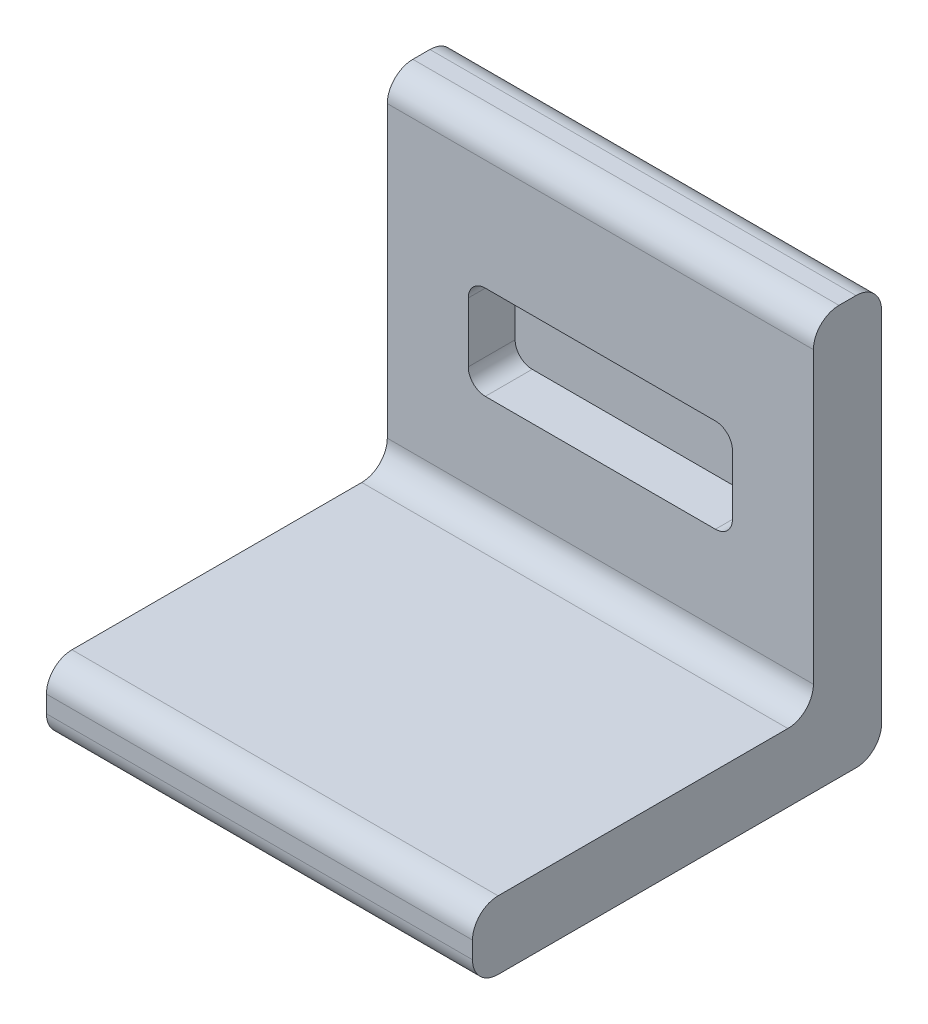
ISO-10303-21;
HEADER;
FILE_DESCRIPTION(('STEP AP214'),'2;1');
FILE_NAME('part.step','',(''),(''),'','','');
FILE_SCHEMA(('AUTOMOTIVE_DESIGN { 1 0 10303 214 1 1 1 1 }'));
ENDSEC;
DATA;
#1=APPLICATION_CONTEXT('core data for automotive mechanical design processes');
#2=APPLICATION_PROTOCOL_DEFINITION('international standard','automotive_design',2000,#1);
#3=PRODUCT_CONTEXT('',#1,'mechanical');
#4=PRODUCT('Part','Part','',(#3));
#5=PRODUCT_RELATED_PRODUCT_CATEGORY('part','',(#4));
#6=PRODUCT_DEFINITION_FORMATION('','',#4);
#7=PRODUCT_DEFINITION_CONTEXT('part definition',#1,'design');
#8=PRODUCT_DEFINITION('design','',#6,#7);
#9=PRODUCT_DEFINITION_SHAPE('','',#8);
#10=(LENGTH_UNIT() NAMED_UNIT(*) SI_UNIT(.MILLI.,.METRE.));
#11=(NAMED_UNIT(*) PLANE_ANGLE_UNIT() SI_UNIT($,.RADIAN.));
#12=(NAMED_UNIT(*) SI_UNIT($,.STERADIAN.) SOLID_ANGLE_UNIT());
#13=UNCERTAINTY_MEASURE_WITH_UNIT(LENGTH_MEASURE(1.E-05),#10,'distance_accuracy_value','');
#14=(GEOMETRIC_REPRESENTATION_CONTEXT(3) GLOBAL_UNCERTAINTY_ASSIGNED_CONTEXT((#13)) GLOBAL_UNIT_ASSIGNED_CONTEXT((#10,
#11,#12)) REPRESENTATION_CONTEXT('',''));
#15=CARTESIAN_POINT('',(0.,0.,0.));
#16=DIRECTION('',(0.,0.,1.));
#17=DIRECTION('',(1.,0.,0.));
#18=AXIS2_PLACEMENT_3D('',#15,#16,#17);
#19=CARTESIAN_POINT('',(-25.,8.,-40.));
#20=DIRECTION('',(1.,0.,0.));
#21=DIRECTION('',(0.,0.,-1.));
#22=AXIS2_PLACEMENT_3D('',#19,#20,#21);
#23=PLANE('',#22);
#24=DIRECTION('',(0.,-1.,0.));
#25=VECTOR('',#24,1.);
#26=CARTESIAN_POINT('',(-25.,8.,0.));
#27=LINE('',#26,#25);
#28=CARTESIAN_POINT('',(-25.,5.,0.));
#29=VERTEX_POINT('',#28);
#30=CARTESIAN_POINT('',(-25.,3.,0.));
#31=VERTEX_POINT('',#30);
#32=EDGE_CURVE('E265',#29,#31,#27,.T.);
#33=ORIENTED_EDGE('',*,*,#32,.F.);
#34=CARTESIAN_POINT('',(-25.,5.,-3.));
#35=DIRECTION('',(1.,0.,0.));
#36=DIRECTION('',(0.,0.,-1.));
#37=AXIS2_PLACEMENT_3D('',#34,#35,#36);
#38=CIRCLE('',#37,3.);
#39=CARTESIAN_POINT('',(-25.,8.,-3.));
#40=VERTEX_POINT('',#39);
#41=EDGE_CURVE('E355',#29,#40,#38,.F.);
#42=ORIENTED_EDGE('',*,*,#41,.T.);
#43=DIRECTION('',(0.,0.,1.));
#44=VECTOR('',#43,1.);
#45=CARTESIAN_POINT('',(-25.,8.,-40.));
#46=LINE('',#45,#44);
#47=CARTESIAN_POINT('',(-25.,8.,-37.));
#48=VERTEX_POINT('',#47);
#49=EDGE_CURVE('E246',#48,#40,#46,.T.);
#50=ORIENTED_EDGE('',*,*,#49,.F.);
#51=CARTESIAN_POINT('',(-25.,11.,-37.));
#52=DIRECTION('',(1.,0.,0.));
#53=DIRECTION('',(0.,0.,-1.));
#54=AXIS2_PLACEMENT_3D('',#51,#52,#53);
#55=CIRCLE('',#54,3.);
#56=CARTESIAN_POINT('',(-25.,11.,-40.));
#57=VERTEX_POINT('',#56);
#58=EDGE_CURVE('E48',#48,#57,#55,.T.);
#59=ORIENTED_EDGE('',*,*,#58,.T.);
#60=DIRECTION('',(0.,1.,0.));
#61=VECTOR('',#60,1.);
#62=CARTESIAN_POINT('',(-25.,48.,-40.));
#63=LINE('',#62,#61);
#64=CARTESIAN_POINT('',(-25.,45.,-40.));
#65=VERTEX_POINT('',#64);
#66=EDGE_CURVE('E226',#57,#65,#63,.T.);
#67=ORIENTED_EDGE('',*,*,#66,.T.);
#68=CARTESIAN_POINT('',(-25.,45.,-43.));
#69=DIRECTION('',(1.,0.,0.));
#70=DIRECTION('',(0.,0.,-1.));
#71=AXIS2_PLACEMENT_3D('',#68,#69,#70);
#72=CIRCLE('',#71,3.);
#73=CARTESIAN_POINT('',(-25.,48.,-43.));
#74=VERTEX_POINT('',#73);
#75=EDGE_CURVE('E352',#65,#74,#72,.F.);
#76=ORIENTED_EDGE('',*,*,#75,.T.);
#77=DIRECTION('',(0.,0.,1.));
#78=VECTOR('',#77,1.);
#79=CARTESIAN_POINT('',(-25.,48.,-48.));
#80=LINE('',#79,#78);
#81=CARTESIAN_POINT('',(-25.,48.,-45.));
#82=VERTEX_POINT('',#81);
#83=EDGE_CURVE('E241',#82,#74,#80,.T.);
#84=ORIENTED_EDGE('',*,*,#83,.F.);
#85=CARTESIAN_POINT('',(-25.,45.,-45.));
#86=DIRECTION('',(1.,0.,0.));
#87=DIRECTION('',(0.,0.,-1.));
#88=AXIS2_PLACEMENT_3D('',#85,#86,#87);
#89=CIRCLE('',#88,3.);
#90=CARTESIAN_POINT('',(-25.,45.,-48.));
#91=VERTEX_POINT('',#90);
#92=EDGE_CURVE('E55',#82,#91,#89,.F.);
#93=ORIENTED_EDGE('',*,*,#92,.T.);
#94=DIRECTION('',(0.,1.,0.));
#95=VECTOR('',#94,1.);
#96=CARTESIAN_POINT('',(-25.,48.,-48.));
#97=LINE('',#96,#95);
#98=CARTESIAN_POINT('',(-25.,3.,-48.));
#99=VERTEX_POINT('',#98);
#100=EDGE_CURVE('E225',#99,#91,#97,.T.);
#101=ORIENTED_EDGE('',*,*,#100,.F.);
#102=CARTESIAN_POINT('',(-25.,3.,-45.));
#103=DIRECTION('',(1.,0.,0.));
#104=DIRECTION('',(0.,0.,-1.));
#105=AXIS2_PLACEMENT_3D('',#102,#103,#104);
#106=CIRCLE('',#105,3.);
#107=CARTESIAN_POINT('',(-25.,0.,-45.));
#108=VERTEX_POINT('',#107);
#109=EDGE_CURVE('E63',#99,#108,#106,.F.);
#110=ORIENTED_EDGE('',*,*,#109,.T.);
#111=DIRECTION('',(0.,0.,1.));
#112=VECTOR('',#111,1.);
#113=CARTESIAN_POINT('',(-25.,0.,-40.));
#114=LINE('',#113,#112);
#115=CARTESIAN_POINT('',(-25.,0.,-3.));
#116=VERTEX_POINT('',#115);
#117=EDGE_CURVE('E245',#108,#116,#114,.T.);
#118=ORIENTED_EDGE('',*,*,#117,.T.);
#119=CARTESIAN_POINT('',(-25.,3.,-3.));
#120=DIRECTION('',(1.,0.,0.));
#121=DIRECTION('',(0.,0.,-1.));
#122=AXIS2_PLACEMENT_3D('',#119,#120,#121);
#123=CIRCLE('',#122,3.);
#124=EDGE_CURVE('E347',#116,#31,#123,.F.);
#125=ORIENTED_EDGE('',*,*,#124,.T.);
#126=EDGE_LOOP('',(#33,#42,#50,#59,#67,#76,#84,#93,#101,#110,#118,#125));
#127=FACE_BOUND('',#126,.T.);
#128=ADVANCED_FACE('F39',(#127),#23,.F.);
#129=CARTESIAN_POINT('',(-25.,8.,0.));
#130=DIRECTION('',(0.,0.,-1.));
#131=DIRECTION('',(-1.,0.,0.));
#132=AXIS2_PLACEMENT_3D('',#129,#130,#131);
#133=PLANE('',#132);
#134=DIRECTION('',(0.,-1.,0.));
#135=VECTOR('',#134,1.);
#136=CARTESIAN_POINT('',(25.,8.,0.));
#137=LINE('',#136,#135);
#138=CARTESIAN_POINT('',(25.,5.,0.));
#139=VERTEX_POINT('',#138);
#140=CARTESIAN_POINT('',(25.,3.,0.));
#141=VERTEX_POINT('',#140);
#142=EDGE_CURVE('E255',#139,#141,#137,.T.);
#143=ORIENTED_EDGE('',*,*,#142,.F.);
#144=DIRECTION('',(1.,0.,0.));
#145=VECTOR('',#144,1.);
#146=CARTESIAN_POINT('',(-25.,5.,0.));
#147=LINE('',#146,#145);
#148=EDGE_CURVE('E342',#139,#29,#147,.F.);
#149=ORIENTED_EDGE('',*,*,#148,.T.);
#150=ORIENTED_EDGE('',*,*,#32,.T.);
#151=DIRECTION('',(1.,0.,0.));
#152=VECTOR('',#151,1.);
#153=CARTESIAN_POINT('',(-25.,3.,0.));
#154=LINE('',#153,#152);
#155=EDGE_CURVE('E338',#31,#141,#154,.T.);
#156=ORIENTED_EDGE('',*,*,#155,.T.);
#157=EDGE_LOOP('',(#143,#149,#150,#156));
#158=FACE_BOUND('',#157,.T.);
#159=ADVANCED_FACE('F401',(#158),#133,.F.);
#160=CARTESIAN_POINT('',(25.,8.,-40.));
#161=DIRECTION('',(-1.,0.,0.));
#162=DIRECTION('',(0.,0.,1.));
#163=AXIS2_PLACEMENT_3D('',#160,#161,#162);
#164=PLANE('',#163);
#165=DIRECTION('',(0.,0.,-1.));
#166=VECTOR('',#165,1.);
#167=CARTESIAN_POINT('',(25.,8.,-40.));
#168=LINE('',#167,#166);
#169=CARTESIAN_POINT('',(25.,8.,-3.));
#170=VERTEX_POINT('',#169);
#171=CARTESIAN_POINT('',(25.,8.,-37.));
#172=VERTEX_POINT('',#171);
#173=EDGE_CURVE('E250',#170,#172,#168,.T.);
#174=ORIENTED_EDGE('',*,*,#173,.F.);
#175=CARTESIAN_POINT('',(25.,5.,-3.));
#176=DIRECTION('',(-1.,0.,0.));
#177=DIRECTION('',(0.,0.,1.));
#178=AXIS2_PLACEMENT_3D('',#175,#176,#177);
#179=CIRCLE('',#178,3.);
#180=EDGE_CURVE('E335',#170,#139,#179,.F.);
#181=ORIENTED_EDGE('',*,*,#180,.T.);
#182=ORIENTED_EDGE('',*,*,#142,.T.);
#183=CARTESIAN_POINT('',(25.,3.,-3.));
#184=DIRECTION('',(-1.,0.,0.));
#185=DIRECTION('',(0.,0.,1.));
#186=AXIS2_PLACEMENT_3D('',#183,#184,#185);
#187=CIRCLE('',#186,3.);
#188=CARTESIAN_POINT('',(25.,0.,-3.));
#189=VERTEX_POINT('',#188);
#190=EDGE_CURVE('E326',#141,#189,#187,.F.);
#191=ORIENTED_EDGE('',*,*,#190,.T.);
#192=DIRECTION('',(0.,0.,-1.));
#193=VECTOR('',#192,1.);
#194=CARTESIAN_POINT('',(25.,0.,-40.));
#195=LINE('',#194,#193);
#196=CARTESIAN_POINT('',(25.,0.,-45.));
#197=VERTEX_POINT('',#196);
#198=EDGE_CURVE('E251',#189,#197,#195,.T.);
#199=ORIENTED_EDGE('',*,*,#198,.T.);
#200=CARTESIAN_POINT('',(25.,3.,-45.));
#201=DIRECTION('',(-1.,0.,0.));
#202=DIRECTION('',(0.,0.,1.));
#203=AXIS2_PLACEMENT_3D('',#200,#201,#202);
#204=CIRCLE('',#203,3.);
#205=CARTESIAN_POINT('',(25.,3.,-48.));
#206=VERTEX_POINT('',#205);
#207=EDGE_CURVE('E323',#197,#206,#204,.F.);
#208=ORIENTED_EDGE('',*,*,#207,.T.);
#209=DIRECTION('',(0.,-1.,0.));
#210=VECTOR('',#209,1.);
#211=CARTESIAN_POINT('',(25.,48.,-48.));
#212=LINE('',#211,#210);
#213=CARTESIAN_POINT('',(25.,45.,-48.));
#214=VERTEX_POINT('',#213);
#215=EDGE_CURVE('E221',#214,#206,#212,.T.);
#216=ORIENTED_EDGE('',*,*,#215,.F.);
#217=CARTESIAN_POINT('',(25.,45.,-45.));
#218=DIRECTION('',(-1.,0.,0.));
#219=DIRECTION('',(0.,0.,1.));
#220=AXIS2_PLACEMENT_3D('',#217,#218,#219);
#221=CIRCLE('',#220,3.);
#222=CARTESIAN_POINT('',(25.,48.,-45.));
#223=VERTEX_POINT('',#222);
#224=EDGE_CURVE('E329',#214,#223,#221,.F.);
#225=ORIENTED_EDGE('',*,*,#224,.T.);
#226=DIRECTION('',(0.,0.,1.));
#227=VECTOR('',#226,1.);
#228=CARTESIAN_POINT('',(25.,48.,-48.));
#229=LINE('',#228,#227);
#230=CARTESIAN_POINT('',(25.,48.,-43.));
#231=VERTEX_POINT('',#230);
#232=EDGE_CURVE('E229',#223,#231,#229,.T.);
#233=ORIENTED_EDGE('',*,*,#232,.T.);
#234=CARTESIAN_POINT('',(25.,45.,-43.));
#235=DIRECTION('',(-1.,0.,0.));
#236=DIRECTION('',(0.,0.,1.));
#237=AXIS2_PLACEMENT_3D('',#234,#235,#236);
#238=CIRCLE('',#237,3.);
#239=CARTESIAN_POINT('',(25.,45.,-40.));
#240=VERTEX_POINT('',#239);
#241=EDGE_CURVE('E332',#231,#240,#238,.F.);
#242=ORIENTED_EDGE('',*,*,#241,.T.);
#243=DIRECTION('',(0.,-1.,0.));
#244=VECTOR('',#243,1.);
#245=CARTESIAN_POINT('',(25.,48.,-40.));
#246=LINE('',#245,#244);
#247=CARTESIAN_POINT('',(25.,11.,-40.));
#248=VERTEX_POINT('',#247);
#249=EDGE_CURVE('E230',#240,#248,#246,.T.);
#250=ORIENTED_EDGE('',*,*,#249,.T.);
#251=CARTESIAN_POINT('',(25.,11.,-37.));
#252=DIRECTION('',(-1.,0.,0.));
#253=DIRECTION('',(0.,0.,1.));
#254=AXIS2_PLACEMENT_3D('',#251,#252,#253);
#255=CIRCLE('',#254,3.);
#256=EDGE_CURVE('E11',#248,#172,#255,.T.);
#257=ORIENTED_EDGE('',*,*,#256,.T.);
#258=EDGE_LOOP('',(#174,#181,#182,#191,#199,#208,#216,#225,#233,#242,#250,#257));
#259=FACE_BOUND('',#258,.T.);
#260=ADVANCED_FACE('F391',(#259),#164,.F.);
#261=CARTESIAN_POINT('',(0.,8.,0.));
#262=DIRECTION('',(0.,1.,0.));
#263=DIRECTION('',(0.,0.,1.));
#264=AXIS2_PLACEMENT_3D('',#261,#262,#263);
#265=PLANE('',#264);
#266=ORIENTED_EDGE('',*,*,#173,.T.);
#267=DIRECTION('',(-1.,0.,0.));
#268=VECTOR('',#267,1.);
#269=CARTESIAN_POINT('',(0.,8.,-37.));
#270=LINE('',#269,#268);
#271=EDGE_CURVE('E313',#172,#48,#270,.T.);
#272=ORIENTED_EDGE('',*,*,#271,.T.);
#273=ORIENTED_EDGE('',*,*,#49,.T.);
#274=DIRECTION('',(1.,0.,0.));
#275=VECTOR('',#274,1.);
#276=CARTESIAN_POINT('',(25.,8.,-3.));
#277=LINE('',#276,#275);
#278=EDGE_CURVE('E309',#40,#170,#277,.T.);
#279=ORIENTED_EDGE('',*,*,#278,.T.);
#280=EDGE_LOOP('',(#266,#272,#273,#279));
#281=FACE_BOUND('',#280,.T.);
#282=ADVANCED_FACE('F393',(#281),#265,.T.);
#283=CARTESIAN_POINT('',(0.,0.,0.));
#284=DIRECTION('',(0.,1.,0.));
#285=DIRECTION('',(0.,0.,1.));
#286=AXIS2_PLACEMENT_3D('',#283,#284,#285);
#287=PLANE('',#286);
#288=ORIENTED_EDGE('',*,*,#198,.F.);
#289=DIRECTION('',(1.,0.,0.));
#290=VECTOR('',#289,1.);
#291=CARTESIAN_POINT('',(0.,0.,-3.));
#292=LINE('',#291,#290);
#293=EDGE_CURVE('E375',#189,#116,#292,.F.);
#294=ORIENTED_EDGE('',*,*,#293,.T.);
#295=ORIENTED_EDGE('',*,*,#117,.F.);
#296=DIRECTION('',(-1.,0.,0.));
#297=VECTOR('',#296,1.);
#298=CARTESIAN_POINT('',(25.,0.,-45.));
#299=LINE('',#298,#297);
#300=EDGE_CURVE('E372',#108,#197,#299,.F.);
#301=ORIENTED_EDGE('',*,*,#300,.T.);
#302=EDGE_LOOP('',(#288,#294,#295,#301));
#303=FACE_BOUND('',#302,.T.);
#304=ADVANCED_FACE('F410',(#303),#287,.F.);
#305=CARTESIAN_POINT('',(25.,48.,-48.));
#306=DIRECTION('',(0.,-1.,0.));
#307=DIRECTION('',(0.,0.,-1.));
#308=AXIS2_PLACEMENT_3D('',#305,#306,#307);
#309=PLANE('',#308);
#310=ORIENTED_EDGE('',*,*,#83,.T.);
#311=DIRECTION('',(1.,0.,0.));
#312=VECTOR('',#311,1.);
#313=CARTESIAN_POINT('',(25.,48.,-43.));
#314=LINE('',#313,#312);
#315=EDGE_CURVE('E361',#74,#231,#314,.T.);
#316=ORIENTED_EDGE('',*,*,#315,.T.);
#317=ORIENTED_EDGE('',*,*,#232,.F.);
#318=DIRECTION('',(1.,0.,0.));
#319=VECTOR('',#318,1.);
#320=CARTESIAN_POINT('',(-25.,48.,-45.));
#321=LINE('',#320,#319);
#322=EDGE_CURVE('E358',#223,#82,#321,.F.);
#323=ORIENTED_EDGE('',*,*,#322,.T.);
#324=EDGE_LOOP('',(#310,#316,#317,#323));
#325=FACE_BOUND('',#324,.T.);
#326=ADVANCED_FACE('F421',(#325),#309,.F.);
#327=CARTESIAN_POINT('',(0.,0.,-48.));
#328=DIRECTION('',(0.,0.,-1.));
#329=DIRECTION('',(-1.,0.,0.));
#330=AXIS2_PLACEMENT_3D('',#327,#328,#329);
#331=PLANE('',#330);
#332=ORIENTED_EDGE('',*,*,#100,.T.);
#333=DIRECTION('',(1.,0.,0.));
#334=VECTOR('',#333,1.);
#335=CARTESIAN_POINT('',(25.,45.,-48.));
#336=LINE('',#335,#334);
#337=EDGE_CURVE('E368',#91,#214,#336,.T.);
#338=ORIENTED_EDGE('',*,*,#337,.T.);
#339=ORIENTED_EDGE('',*,*,#215,.T.);
#340=DIRECTION('',(-1.,0.,0.));
#341=VECTOR('',#340,1.);
#342=CARTESIAN_POINT('',(-25.,3.,-48.));
#343=LINE('',#342,#341);
#344=EDGE_CURVE('E365',#206,#99,#343,.T.);
#345=ORIENTED_EDGE('',*,*,#344,.T.);
#346=EDGE_LOOP('',(#332,#338,#339,#345));
#347=FACE_BOUND('',#346,.T.);
#348=ADVANCED_FACE('F414',(#347),#331,.T.);
#349=CARTESIAN_POINT('',(0.,0.,-40.));
#350=DIRECTION('',(0.,0.,-1.));
#351=DIRECTION('',(-1.,0.,0.));
#352=AXIS2_PLACEMENT_3D('',#349,#350,#351);
#353=PLANE('',#352);
#354=DIRECTION('',(1.,0.,0.));
#355=VECTOR('',#354,1.);
#356=CARTESIAN_POINT('',(-15.5,21.,-40.));
#357=LINE('',#356,#355);
#358=CARTESIAN_POINT('',(-13.5,21.,-40.));
#359=VERTEX_POINT('',#358);
#360=CARTESIAN_POINT('',(13.5,21.,-40.));
#361=VERTEX_POINT('',#360);
#362=EDGE_CURVE('E210',#359,#361,#357,.T.);
#363=ORIENTED_EDGE('',*,*,#362,.F.);
#364=CARTESIAN_POINT('',(-13.5,23.,-40.));
#365=DIRECTION('',(0.,0.,-1.));
#366=DIRECTION('',(-1.,0.,0.));
#367=AXIS2_PLACEMENT_3D('',#364,#365,#366);
#368=CIRCLE('',#367,2.);
#369=CARTESIAN_POINT('',(-15.5,23.,-40.));
#370=VERTEX_POINT('',#369);
#371=EDGE_CURVE('E306',#359,#370,#368,.T.);
#372=ORIENTED_EDGE('',*,*,#371,.T.);
#373=DIRECTION('',(0.,-1.,0.));
#374=VECTOR('',#373,1.);
#375=CARTESIAN_POINT('',(-15.5,32.,-40.));
#376=LINE('',#375,#374);
#377=CARTESIAN_POINT('',(-15.5,30.,-40.));
#378=VERTEX_POINT('',#377);
#379=EDGE_CURVE('E217',#378,#370,#376,.T.);
#380=ORIENTED_EDGE('',*,*,#379,.F.);
#381=CARTESIAN_POINT('',(-13.5,30.,-40.));
#382=DIRECTION('',(0.,0.,-1.));
#383=DIRECTION('',(-1.,0.,0.));
#384=AXIS2_PLACEMENT_3D('',#381,#382,#383);
#385=CIRCLE('',#384,2.);
#386=CARTESIAN_POINT('',(-13.5,32.,-40.));
#387=VERTEX_POINT('',#386);
#388=EDGE_CURVE('E303',#378,#387,#385,.T.);
#389=ORIENTED_EDGE('',*,*,#388,.T.);
#390=DIRECTION('',(-1.,0.,0.));
#391=VECTOR('',#390,1.);
#392=CARTESIAN_POINT('',(-15.5,32.,-40.));
#393=LINE('',#392,#391);
#394=CARTESIAN_POINT('',(13.5,32.,-40.));
#395=VERTEX_POINT('',#394);
#396=EDGE_CURVE('E209',#395,#387,#393,.T.);
#397=ORIENTED_EDGE('',*,*,#396,.F.);
#398=CARTESIAN_POINT('',(13.5,30.,-40.));
#399=DIRECTION('',(0.,0.,-1.));
#400=DIRECTION('',(-1.,0.,0.));
#401=AXIS2_PLACEMENT_3D('',#398,#399,#400);
#402=CIRCLE('',#401,2.);
#403=CARTESIAN_POINT('',(15.5,30.,-40.));
#404=VERTEX_POINT('',#403);
#405=EDGE_CURVE('E190',#395,#404,#402,.T.);
#406=ORIENTED_EDGE('',*,*,#405,.T.);
#407=DIRECTION('',(0.,1.,0.));
#408=VECTOR('',#407,1.);
#409=CARTESIAN_POINT('',(15.5,32.,-40.));
#410=LINE('',#409,#408);
#411=CARTESIAN_POINT('',(15.5,23.,-40.));
#412=VERTEX_POINT('',#411);
#413=EDGE_CURVE('E197',#412,#404,#410,.T.);
#414=ORIENTED_EDGE('',*,*,#413,.F.);
#415=CARTESIAN_POINT('',(13.5,23.,-40.));
#416=DIRECTION('',(0.,0.,-1.));
#417=DIRECTION('',(-1.,0.,0.));
#418=AXIS2_PLACEMENT_3D('',#415,#416,#417);
#419=CIRCLE('',#418,2.);
#420=EDGE_CURVE('E179',#412,#361,#419,.T.);
#421=ORIENTED_EDGE('',*,*,#420,.T.);
#422=EDGE_LOOP('',(#363,#372,#380,#389,#397,#406,#414,#421));
#423=FACE_BOUND('',#422,.T.);
#424=ORIENTED_EDGE('',*,*,#66,.F.);
#425=DIRECTION('',(-1.,0.,0.));
#426=VECTOR('',#425,1.);
#427=CARTESIAN_POINT('',(0.,11.,-40.));
#428=LINE('',#427,#426);
#429=EDGE_CURVE('E320',#57,#248,#428,.F.);
#430=ORIENTED_EDGE('',*,*,#429,.T.);
#431=ORIENTED_EDGE('',*,*,#249,.F.);
#432=DIRECTION('',(1.,0.,0.));
#433=VECTOR('',#432,1.);
#434=CARTESIAN_POINT('',(0.,45.,-40.));
#435=LINE('',#434,#433);
#436=EDGE_CURVE('E317',#240,#65,#435,.F.);
#437=ORIENTED_EDGE('',*,*,#436,.T.);
#438=EDGE_LOOP('',(#424,#430,#431,#437));
#439=FACE_BOUND('',#438,.T.);
#440=ADVANCED_FACE('F205',(#423,#439),#353,.F.);
#441=CARTESIAN_POINT('',(-15.5,32.,-45.5));
#442=DIRECTION('',(-1.,0.,0.));
#443=DIRECTION('',(0.,0.,1.));
#444=AXIS2_PLACEMENT_3D('',#441,#442,#443);
#445=PLANE('',#444);
#446=DIRECTION('',(0.,-1.,0.));
#447=VECTOR('',#446,1.);
#448=CARTESIAN_POINT('',(-15.5,32.,-45.5));
#449=LINE('',#448,#447);
#450=CARTESIAN_POINT('',(-15.5,30.,-45.5));
#451=VERTEX_POINT('',#450);
#452=CARTESIAN_POINT('',(-15.5,23.,-45.5));
#453=VERTEX_POINT('',#452);
#454=EDGE_CURVE('E215',#451,#453,#449,.T.);
#455=ORIENTED_EDGE('',*,*,#454,.F.);
#456=DIRECTION('',(0.,0.,1.));
#457=VECTOR('',#456,1.);
#458=CARTESIAN_POINT('',(-15.5,30.,-40.));
#459=LINE('',#458,#457);
#460=EDGE_CURVE('E191',#451,#378,#459,.T.);
#461=ORIENTED_EDGE('',*,*,#460,.T.);
#462=ORIENTED_EDGE('',*,*,#379,.T.);
#463=DIRECTION('',(0.,0.,1.));
#464=VECTOR('',#463,1.);
#465=CARTESIAN_POINT('',(-15.5,23.,-45.5));
#466=LINE('',#465,#464);
#467=EDGE_CURVE('E295',#370,#453,#466,.F.);
#468=ORIENTED_EDGE('',*,*,#467,.T.);
#469=EDGE_LOOP('',(#455,#461,#462,#468));
#470=FACE_BOUND('',#469,.T.);
#471=ADVANCED_FACE('F546',(#470),#445,.F.);
#472=CARTESIAN_POINT('',(-15.5,32.,-45.5));
#473=DIRECTION('',(0.,1.,0.));
#474=DIRECTION('',(0.,0.,1.));
#475=AXIS2_PLACEMENT_3D('',#472,#473,#474);
#476=PLANE('',#475);
#477=DIRECTION('',(-1.,0.,0.));
#478=VECTOR('',#477,1.);
#479=CARTESIAN_POINT('',(-15.5,32.,-45.5));
#480=LINE('',#479,#478);
#481=CARTESIAN_POINT('',(13.5,32.,-45.5));
#482=VERTEX_POINT('',#481);
#483=CARTESIAN_POINT('',(-13.5,32.,-45.5));
#484=VERTEX_POINT('',#483);
#485=EDGE_CURVE('E234',#482,#484,#480,.T.);
#486=ORIENTED_EDGE('',*,*,#485,.F.);
#487=DIRECTION('',(0.,0.,1.));
#488=VECTOR('',#487,1.);
#489=CARTESIAN_POINT('',(13.5,32.,-40.));
#490=LINE('',#489,#488);
#491=EDGE_CURVE('E291',#482,#395,#490,.T.);
#492=ORIENTED_EDGE('',*,*,#491,.T.);
#493=ORIENTED_EDGE('',*,*,#396,.T.);
#494=DIRECTION('',(0.,0.,1.));
#495=VECTOR('',#494,1.);
#496=CARTESIAN_POINT('',(-13.5,32.,-45.5));
#497=LINE('',#496,#495);
#498=EDGE_CURVE('E288',#387,#484,#497,.F.);
#499=ORIENTED_EDGE('',*,*,#498,.T.);
#500=EDGE_LOOP('',(#486,#492,#493,#499));
#501=FACE_BOUND('',#500,.T.);
#502=ADVANCED_FACE('F538',(#501),#476,.F.);
#503=CARTESIAN_POINT('',(15.5,32.,-45.5));
#504=DIRECTION('',(1.,0.,0.));
#505=DIRECTION('',(0.,0.,-1.));
#506=AXIS2_PLACEMENT_3D('',#503,#504,#505);
#507=PLANE('',#506);
#508=DIRECTION('',(0.,1.,0.));
#509=VECTOR('',#508,1.);
#510=CARTESIAN_POINT('',(15.5,32.,-45.5));
#511=LINE('',#510,#509);
#512=CARTESIAN_POINT('',(15.5,23.,-45.5));
#513=VERTEX_POINT('',#512);
#514=CARTESIAN_POINT('',(15.5,30.,-45.5));
#515=VERTEX_POINT('',#514);
#516=EDGE_CURVE('E200',#513,#515,#511,.T.);
#517=ORIENTED_EDGE('',*,*,#516,.F.);
#518=DIRECTION('',(0.,0.,1.));
#519=VECTOR('',#518,1.);
#520=CARTESIAN_POINT('',(15.5,23.,-40.));
#521=LINE('',#520,#519);
#522=EDGE_CURVE('E183',#513,#412,#521,.T.);
#523=ORIENTED_EDGE('',*,*,#522,.T.);
#524=ORIENTED_EDGE('',*,*,#413,.T.);
#525=DIRECTION('',(0.,0.,1.));
#526=VECTOR('',#525,1.);
#527=CARTESIAN_POINT('',(15.5,30.,-45.5));
#528=LINE('',#527,#526);
#529=EDGE_CURVE('E203',#404,#515,#528,.F.);
#530=ORIENTED_EDGE('',*,*,#529,.T.);
#531=EDGE_LOOP('',(#517,#523,#524,#530));
#532=FACE_BOUND('',#531,.T.);
#533=ADVANCED_FACE('F196',(#532),#507,.F.);
#534=CARTESIAN_POINT('',(-15.5,21.,-45.5));
#535=DIRECTION('',(0.,-1.,0.));
#536=DIRECTION('',(0.,0.,-1.));
#537=AXIS2_PLACEMENT_3D('',#534,#535,#536);
#538=PLANE('',#537);
#539=ORIENTED_EDGE('',*,*,#362,.T.);
#540=DIRECTION('',(0.,0.,1.));
#541=VECTOR('',#540,1.);
#542=CARTESIAN_POINT('',(13.5,21.,-45.5));
#543=LINE('',#542,#541);
#544=CARTESIAN_POINT('',(13.5,21.,-45.5));
#545=VERTEX_POINT('',#544);
#546=EDGE_CURVE('E184',#361,#545,#543,.F.);
#547=ORIENTED_EDGE('',*,*,#546,.T.);
#548=DIRECTION('',(1.,0.,0.));
#549=VECTOR('',#548,1.);
#550=CARTESIAN_POINT('',(-15.5,21.,-45.5));
#551=LINE('',#550,#549);
#552=CARTESIAN_POINT('',(-13.5,21.,-45.5));
#553=VERTEX_POINT('',#552);
#554=EDGE_CURVE('E638',#553,#545,#551,.T.);
#555=ORIENTED_EDGE('',*,*,#554,.F.);
#556=DIRECTION('',(0.,0.,1.));
#557=VECTOR('',#556,1.);
#558=CARTESIAN_POINT('',(-13.5,21.,-40.));
#559=LINE('',#558,#557);
#560=EDGE_CURVE('E202',#553,#359,#559,.T.);
#561=ORIENTED_EDGE('',*,*,#560,.T.);
#562=EDGE_LOOP('',(#539,#547,#555,#561));
#563=FACE_BOUND('',#562,.T.);
#564=ADVANCED_FACE('F521',(#563),#538,.F.);
#565=CARTESIAN_POINT('',(0.,0.,-45.5));
#566=DIRECTION('',(0.,0.,1.));
#567=DIRECTION('',(1.,0.,0.));
#568=AXIS2_PLACEMENT_3D('',#565,#566,#567);
#569=PLANE('',#568);
#570=ORIENTED_EDGE('',*,*,#554,.T.);
#571=CARTESIAN_POINT('',(13.5,23.,-45.5));
#572=DIRECTION('',(0.,0.,1.));
#573=DIRECTION('',(1.,0.,0.));
#574=AXIS2_PLACEMENT_3D('',#571,#572,#573);
#575=CIRCLE('',#574,2.);
#576=EDGE_CURVE('E285',#545,#513,#575,.T.);
#577=ORIENTED_EDGE('',*,*,#576,.T.);
#578=ORIENTED_EDGE('',*,*,#516,.T.);
#579=CARTESIAN_POINT('',(13.5,30.,-45.5));
#580=DIRECTION('',(0.,0.,1.));
#581=DIRECTION('',(1.,0.,0.));
#582=AXIS2_PLACEMENT_3D('',#579,#580,#581);
#583=CIRCLE('',#582,2.);
#584=EDGE_CURVE('E282',#515,#482,#583,.T.);
#585=ORIENTED_EDGE('',*,*,#584,.T.);
#586=ORIENTED_EDGE('',*,*,#485,.T.);
#587=CARTESIAN_POINT('',(-13.5,30.,-45.5));
#588=DIRECTION('',(0.,0.,1.));
#589=DIRECTION('',(1.,0.,0.));
#590=AXIS2_PLACEMENT_3D('',#587,#588,#589);
#591=CIRCLE('',#590,2.);
#592=EDGE_CURVE('E279',#484,#451,#591,.T.);
#593=ORIENTED_EDGE('',*,*,#592,.T.);
#594=ORIENTED_EDGE('',*,*,#454,.T.);
#595=CARTESIAN_POINT('',(-13.5,23.,-45.5));
#596=DIRECTION('',(0.,0.,1.));
#597=DIRECTION('',(1.,0.,0.));
#598=AXIS2_PLACEMENT_3D('',#595,#596,#597);
#599=CIRCLE('',#598,2.);
#600=EDGE_CURVE('E276',#453,#553,#599,.T.);
#601=ORIENTED_EDGE('',*,*,#600,.T.);
#602=EDGE_LOOP('',(#570,#577,#578,#585,#586,#593,#594,#601));
#603=FACE_BOUND('',#602,.T.);
#604=ADVANCED_FACE('F444',(#603),#569,.T.);
#605=CARTESIAN_POINT('',(13.5,23.,-45.5));
#606=DIRECTION('',(0.,0.,-1.));
#607=DIRECTION('',(-1.,0.,0.));
#608=AXIS2_PLACEMENT_3D('',#605,#606,#607);
#609=CYLINDRICAL_SURFACE('',#608,2.);
#610=ORIENTED_EDGE('',*,*,#576,.F.);
#611=ORIENTED_EDGE('',*,*,#546,.F.);
#612=ORIENTED_EDGE('',*,*,#420,.F.);
#613=ORIENTED_EDGE('',*,*,#522,.F.);
#614=EDGE_LOOP('',(#610,#611,#612,#613));
#615=FACE_BOUND('',#614,.T.);
#616=ADVANCED_FACE('F182',(#615),#609,.F.);
#617=CARTESIAN_POINT('',(13.5,30.,-45.5));
#618=DIRECTION('',(0.,0.,-1.));
#619=DIRECTION('',(-1.,0.,0.));
#620=AXIS2_PLACEMENT_3D('',#617,#618,#619);
#621=CYLINDRICAL_SURFACE('',#620,2.);
#622=ORIENTED_EDGE('',*,*,#584,.F.);
#623=ORIENTED_EDGE('',*,*,#529,.F.);
#624=ORIENTED_EDGE('',*,*,#405,.F.);
#625=ORIENTED_EDGE('',*,*,#491,.F.);
#626=EDGE_LOOP('',(#622,#623,#624,#625));
#627=FACE_BOUND('',#626,.T.);
#628=ADVANCED_FACE('F443',(#627),#621,.F.);
#629=CARTESIAN_POINT('',(-13.5,30.,-45.5));
#630=DIRECTION('',(0.,0.,-1.));
#631=DIRECTION('',(-1.,0.,0.));
#632=AXIS2_PLACEMENT_3D('',#629,#630,#631);
#633=CYLINDRICAL_SURFACE('',#632,2.);
#634=ORIENTED_EDGE('',*,*,#592,.F.);
#635=ORIENTED_EDGE('',*,*,#498,.F.);
#636=ORIENTED_EDGE('',*,*,#388,.F.);
#637=ORIENTED_EDGE('',*,*,#460,.F.);
#638=EDGE_LOOP('',(#634,#635,#636,#637));
#639=FACE_BOUND('',#638,.T.);
#640=ADVANCED_FACE('F447',(#639),#633,.F.);
#641=CARTESIAN_POINT('',(-13.5,23.,-45.5));
#642=DIRECTION('',(0.,0.,-1.));
#643=DIRECTION('',(-1.,0.,0.));
#644=AXIS2_PLACEMENT_3D('',#641,#642,#643);
#645=CYLINDRICAL_SURFACE('',#644,2.);
#646=ORIENTED_EDGE('',*,*,#600,.F.);
#647=ORIENTED_EDGE('',*,*,#467,.F.);
#648=ORIENTED_EDGE('',*,*,#371,.F.);
#649=ORIENTED_EDGE('',*,*,#560,.F.);
#650=EDGE_LOOP('',(#646,#647,#648,#649));
#651=FACE_BOUND('',#650,.T.);
#652=ADVANCED_FACE('F451',(#651),#645,.F.);
#653=CARTESIAN_POINT('',(0.,11.,-37.));
#654=DIRECTION('',(-1.,0.,0.));
#655=DIRECTION('',(0.,0.,1.));
#656=AXIS2_PLACEMENT_3D('',#653,#654,#655);
#657=CYLINDRICAL_SURFACE('',#656,3.);
#658=ORIENTED_EDGE('',*,*,#256,.F.);
#659=ORIENTED_EDGE('',*,*,#429,.F.);
#660=ORIENTED_EDGE('',*,*,#58,.F.);
#661=ORIENTED_EDGE('',*,*,#271,.F.);
#662=EDGE_LOOP('',(#658,#659,#660,#661));
#663=FACE_BOUND('',#662,.T.);
#664=ADVANCED_FACE('F388',(#663),#657,.F.);
#665=CARTESIAN_POINT('',(0.,5.,-3.));
#666=DIRECTION('',(-1.,0.,0.));
#667=DIRECTION('',(0.,0.,1.));
#668=AXIS2_PLACEMENT_3D('',#665,#666,#667);
#669=CYLINDRICAL_SURFACE('',#668,3.);
#670=ORIENTED_EDGE('',*,*,#41,.F.);
#671=ORIENTED_EDGE('',*,*,#148,.F.);
#672=ORIENTED_EDGE('',*,*,#180,.F.);
#673=ORIENTED_EDGE('',*,*,#278,.F.);
#674=EDGE_LOOP('',(#670,#671,#672,#673));
#675=FACE_BOUND('',#674,.T.);
#676=ADVANCED_FACE('F397',(#675),#669,.T.);
#677=CARTESIAN_POINT('',(25.,45.,-43.));
#678=DIRECTION('',(1.,0.,0.));
#679=DIRECTION('',(0.,0.,-1.));
#680=AXIS2_PLACEMENT_3D('',#677,#678,#679);
#681=CYLINDRICAL_SURFACE('',#680,3.);
#682=ORIENTED_EDGE('',*,*,#75,.F.);
#683=ORIENTED_EDGE('',*,*,#436,.F.);
#684=ORIENTED_EDGE('',*,*,#241,.F.);
#685=ORIENTED_EDGE('',*,*,#315,.F.);
#686=EDGE_LOOP('',(#682,#683,#684,#685));
#687=FACE_BOUND('',#686,.T.);
#688=ADVANCED_FACE('F424',(#687),#681,.T.);
#689=CARTESIAN_POINT('',(0.,45.,-45.));
#690=DIRECTION('',(-1.,0.,0.));
#691=DIRECTION('',(0.,0.,1.));
#692=AXIS2_PLACEMENT_3D('',#689,#690,#691);
#693=CYLINDRICAL_SURFACE('',#692,3.);
#694=ORIENTED_EDGE('',*,*,#92,.F.);
#695=ORIENTED_EDGE('',*,*,#322,.F.);
#696=ORIENTED_EDGE('',*,*,#224,.F.);
#697=ORIENTED_EDGE('',*,*,#337,.F.);
#698=EDGE_LOOP('',(#694,#695,#696,#697));
#699=FACE_BOUND('',#698,.T.);
#700=ADVANCED_FACE('F417',(#699),#693,.T.);
#701=CARTESIAN_POINT('',(-25.,3.,-3.));
#702=DIRECTION('',(1.,0.,0.));
#703=DIRECTION('',(0.,0.,-1.));
#704=AXIS2_PLACEMENT_3D('',#701,#702,#703);
#705=CYLINDRICAL_SURFACE('',#704,3.);
#706=ORIENTED_EDGE('',*,*,#124,.F.);
#707=ORIENTED_EDGE('',*,*,#293,.F.);
#708=ORIENTED_EDGE('',*,*,#190,.F.);
#709=ORIENTED_EDGE('',*,*,#155,.F.);
#710=EDGE_LOOP('',(#706,#707,#708,#709));
#711=FACE_BOUND('',#710,.T.);
#712=ADVANCED_FACE('F405',(#711),#705,.T.);
#713=CARTESIAN_POINT('',(0.,3.,-45.));
#714=DIRECTION('',(1.,0.,0.));
#715=DIRECTION('',(0.,0.,-1.));
#716=AXIS2_PLACEMENT_3D('',#713,#714,#715);
#717=CYLINDRICAL_SURFACE('',#716,3.);
#718=ORIENTED_EDGE('',*,*,#207,.F.);
#719=ORIENTED_EDGE('',*,*,#300,.F.);
#720=ORIENTED_EDGE('',*,*,#109,.F.);
#721=ORIENTED_EDGE('',*,*,#344,.F.);
#722=EDGE_LOOP('',(#718,#719,#720,#721));
#723=FACE_BOUND('',#722,.T.);
#724=ADVANCED_FACE('F41',(#723),#717,.T.);
#725=CLOSED_SHELL('',(#128,#159,#260,#282,#304,#326,#348,#440,#471,#502,#533,#564,#604,#616,
#628,#640,#652,#664,#676,#688,#700,#712,#724));
#726=MANIFOLD_SOLID_BREP('B2',#725);
#727=ADVANCED_BREP_SHAPE_REPRESENTATION('',(#18,#726),#14);
#728=SHAPE_DEFINITION_REPRESENTATION(#9,#727);
ENDSEC;
END-ISO-10303-21;
